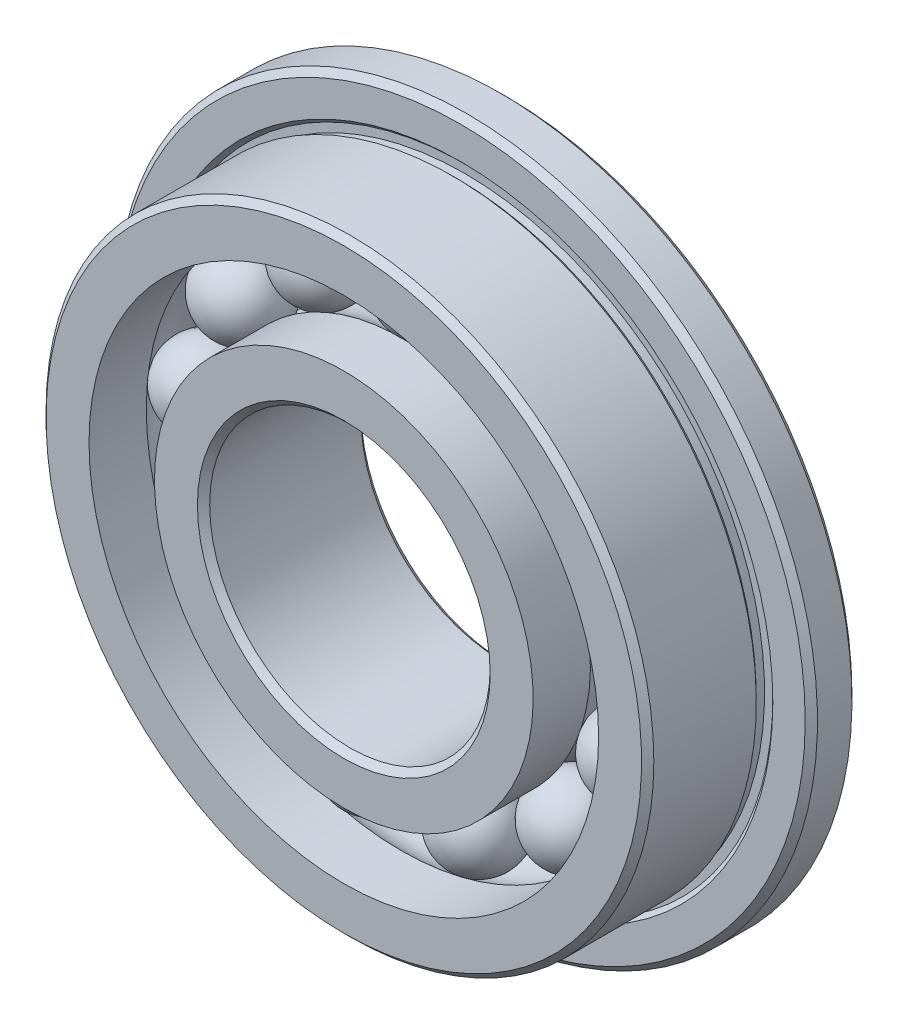
ISO-10303-21;
HEADER;
FILE_DESCRIPTION(('STEP AP214'),'2;1');
FILE_NAME('part.step','',(''),(''),'','','');
FILE_SCHEMA(('AUTOMOTIVE_DESIGN { 1 0 10303 214 1 1 1 1 }'));
ENDSEC;
DATA;
#1=APPLICATION_CONTEXT('core data for automotive mechanical design processes');
#2=APPLICATION_PROTOCOL_DEFINITION('international standard','automotive_design',2000,#1);
#3=PRODUCT_CONTEXT('',#1,'mechanical');
#4=PRODUCT('Part','Part','',(#3));
#5=PRODUCT_RELATED_PRODUCT_CATEGORY('part','',(#4));
#6=PRODUCT_DEFINITION_FORMATION('','',#4);
#7=PRODUCT_DEFINITION_CONTEXT('part definition',#1,'design');
#8=PRODUCT_DEFINITION('design','',#6,#7);
#9=PRODUCT_DEFINITION_SHAPE('','',#8);
#10=(LENGTH_UNIT() NAMED_UNIT(*) SI_UNIT(.MILLI.,.METRE.));
#11=(NAMED_UNIT(*) PLANE_ANGLE_UNIT() SI_UNIT($,.RADIAN.));
#12=(NAMED_UNIT(*) SI_UNIT($,.STERADIAN.) SOLID_ANGLE_UNIT());
#13=UNCERTAINTY_MEASURE_WITH_UNIT(LENGTH_MEASURE(1.E-05),#10,'distance_accuracy_value','');
#14=(GEOMETRIC_REPRESENTATION_CONTEXT(3) GLOBAL_UNCERTAINTY_ASSIGNED_CONTEXT((#13)) GLOBAL_UNIT_ASSIGNED_CONTEXT((#10,
#11,#12)) REPRESENTATION_CONTEXT('',''));
#15=CARTESIAN_POINT('',(0.,0.,0.));
#16=DIRECTION('',(0.,0.,1.));
#17=DIRECTION('',(1.,0.,0.));
#18=AXIS2_PLACEMENT_3D('',#15,#16,#17);
#19=CARTESIAN_POINT('',(-2.20743506720785,4.20591612185278,0.));
#20=DIRECTION('',(-0.464723172043758,0.885456025653216,0.));
#21=DIRECTION('',(0.885456025653216,0.464723172043758,0.));
#22=AXIS2_PLACEMENT_3D('',#19,#20,#21);
#23=SPHERICAL_SURFACE('',#22,0.875);
#24=CARTESIAN_POINT('',(-2.61406784274614,4.98069014429934,0.));
#25=VERTEX_POINT('',#24);
#26=VERTEX_LOOP('',#25);
#27=FACE_BOUND('',#26,.T.);
#28=ADVANCED_FACE('F41',(#27),#23,.T.);
#29=CLOSED_SHELL('',(#28));
#30=MANIFOLD_SOLID_BREP('B2',#29);
#31=CARTESIAN_POINT('',(-3.90917336299484,2.69830754697304,0.));
#32=DIRECTION('',(-0.82298386589365,0.568064746731166,0.));
#33=DIRECTION('',(0.568064746731166,0.82298386589365,0.));
#34=AXIS2_PLACEMENT_3D('',#31,#32,#33);
#35=SPHERICAL_SURFACE('',#34,0.875);
#36=CARTESIAN_POINT('',(-4.62928424565178,3.19536420036281,0.));
#37=VERTEX_POINT('',#36);
#38=VERTEX_LOOP('',#37);
#39=FACE_BOUND('',#38,.T.);
#40=ADVANCED_FACE('F61',(#39),#35,.T.);
#41=CLOSED_SHELL('',(#40));
#42=MANIFOLD_SOLID_BREP('B7',#41);
#43=CARTESIAN_POINT('',(-4.71536715196575,0.572549231212836,0.));
#44=DIRECTION('',(-0.992708874098053,0.120536680255334,0.));
#45=DIRECTION('',(0.120536680255334,0.992708874098053,0.));
#46=AXIS2_PLACEMENT_3D('',#43,#44,#45);
#47=SPHERICAL_SURFACE('',#46,0.875);
#48=CARTESIAN_POINT('',(-5.58398741680155,0.678018826436253,0.));
#49=VERTEX_POINT('',#48);
#50=VERTEX_LOOP('',#49);
#51=FACE_BOUND('',#50,.T.);
#52=ADVANCED_FACE('F81',(#51),#47,.T.);
#53=CLOSED_SHELL('',(#52));
#54=MANIFOLD_SOLID_BREP('B37',#53);
#55=CARTESIAN_POINT('',(-4.44132715275574,-1.684373213452,0.));
#56=DIRECTION('',(-0.935016242685418,-0.354604887042527,0.));
#57=DIRECTION('',(-0.354604887042527,0.935016242685418,0.));
#58=AXIS2_PLACEMENT_3D('',#55,#56,#57);
#59=SPHERICAL_SURFACE('',#58,0.875);
#60=CARTESIAN_POINT('',(-5.25946636510548,-1.99465248961421,0.));
#61=VERTEX_POINT('',#60);
#62=VERTEX_LOOP('',#61);
#63=FACE_BOUND('',#62,.T.);
#64=ADVANCED_FACE('F101',(#63),#59,.T.);
#65=CLOSED_SHELL('',(#64));
#66=MANIFOLD_SOLID_BREP('B57',#65);
#67=CARTESIAN_POINT('',(-3.14983262664381,-3.5554260538127,0.));
#68=DIRECTION('',(-0.663122658240802,-0.748510748171096,0.));
#69=DIRECTION('',(-0.748510748171096,0.663122658240802,0.));
#70=AXIS2_PLACEMENT_3D('',#67,#68,#69);
#71=SPHERICAL_SURFACE('',#70,0.875);
#72=CARTESIAN_POINT('',(-3.73006495260451,-4.21037295846241,0.));
#73=VERTEX_POINT('',#72);
#74=VERTEX_LOOP('',#73);
#75=FACE_BOUND('',#74,.T.);
#76=ADVANCED_FACE('F121',(#75),#71,.T.);
#77=CLOSED_SHELL('',(#76));
#78=MANIFOLD_SOLID_BREP('B77',#77);
#79=CARTESIAN_POINT('',(-1.13674940536593,-4.61197363277374,0.));
#80=DIRECTION('',(-0.239315664287565,-0.97094181742605,0.));
#81=DIRECTION('',(-0.97094181742605,0.239315664287565,0.));
#82=AXIS2_PLACEMENT_3D('',#79,#80,#81);
#83=SPHERICAL_SURFACE('',#82,0.875);
#84=CARTESIAN_POINT('',(-1.34615061161755,-5.46154772302153,0.));
#85=VERTEX_POINT('',#84);
#86=VERTEX_LOOP('',#85);
#87=FACE_BOUND('',#86,.T.);
#88=ADVANCED_FACE('F141',(#87),#83,.T.);
#89=CLOSED_SHELL('',(#88));
#90=MANIFOLD_SOLID_BREP('B97',#89);
#91=CARTESIAN_POINT('',(1.13674940536587,-4.61197363277375,0.));
#92=DIRECTION('',(0.239315664287552,-0.970941817426054,0.));
#93=DIRECTION('',(-0.970941817426054,-0.239315664287552,0.));
#94=AXIS2_PLACEMENT_3D('',#91,#92,#93);
#95=SPHERICAL_SURFACE('',#94,0.875);
#96=CARTESIAN_POINT('',(1.34615061161748,-5.46154772302155,0.));
#97=VERTEX_POINT('',#96);
#98=VERTEX_LOOP('',#97);
#99=FACE_BOUND('',#98,.T.);
#100=ADVANCED_FACE('F161',(#99),#95,.T.);
#101=CLOSED_SHELL('',(#100));
#102=MANIFOLD_SOLID_BREP('B117',#101);
#103=CARTESIAN_POINT('',(3.14983262664376,-3.55542605381275,0.));
#104=DIRECTION('',(0.663122658240791,-0.748510748171105,0.));
#105=DIRECTION('',(-0.748510748171105,-0.663122658240791,0.));
#106=AXIS2_PLACEMENT_3D('',#103,#104,#105);
#107=SPHERICAL_SURFACE('',#106,0.875);
#108=CARTESIAN_POINT('',(3.73006495260445,-4.21037295846246,0.));
#109=VERTEX_POINT('',#108);
#110=VERTEX_LOOP('',#109);
#111=FACE_BOUND('',#110,.T.);
#112=ADVANCED_FACE('F181',(#111),#107,.T.);
#113=CLOSED_SHELL('',(#112));
#114=MANIFOLD_SOLID_BREP('B137',#113);
#115=CARTESIAN_POINT('',(4.44132715275571,-1.68437321345206,0.));
#116=DIRECTION('',(0.935016242685413,-0.354604887042539,0.));
#117=DIRECTION('',(-0.354604887042539,-0.935016242685413,0.));
#118=AXIS2_PLACEMENT_3D('',#115,#116,#117);
#119=SPHERICAL_SURFACE('',#118,0.875);
#120=CARTESIAN_POINT('',(5.25946636510545,-1.99465248961429,0.));
#121=VERTEX_POINT('',#120);
#122=VERTEX_LOOP('',#121);
#123=FACE_BOUND('',#122,.T.);
#124=ADVANCED_FACE('F201',(#123),#119,.T.);
#125=CLOSED_SHELL('',(#124));
#126=MANIFOLD_SOLID_BREP('B157',#125);
#127=CARTESIAN_POINT('',(4.71536715196576,0.57254923121277,0.));
#128=DIRECTION('',(0.992708874098054,0.12053668025532,0.));
#129=DIRECTION('',(0.12053668025532,-0.992708874098054,0.));
#130=AXIS2_PLACEMENT_3D('',#127,#128,#129);
#131=SPHERICAL_SURFACE('',#130,0.875);
#132=CARTESIAN_POINT('',(5.58398741680156,0.678018826436175,0.));
#133=VERTEX_POINT('',#132);
#134=VERTEX_LOOP('',#133);
#135=FACE_BOUND('',#134,.T.);
#136=ADVANCED_FACE('F221',(#135),#131,.T.);
#137=CLOSED_SHELL('',(#136));
#138=MANIFOLD_SOLID_BREP('B177',#137);
#139=CARTESIAN_POINT('',(3.90917336299487,2.69830754697298,0.));
#140=DIRECTION('',(0.822983865893657,0.568064746731154,0.));
#141=DIRECTION('',(0.568064746731154,-0.822983865893657,0.));
#142=AXIS2_PLACEMENT_3D('',#139,#140,#141);
#143=SPHERICAL_SURFACE('',#142,0.875);
#144=CARTESIAN_POINT('',(4.62928424565182,3.19536420036274,0.));
#145=VERTEX_POINT('',#144);
#146=VERTEX_LOOP('',#145);
#147=FACE_BOUND('',#146,.T.);
#148=ADVANCED_FACE('F241',(#147),#143,.T.);
#149=CLOSED_SHELL('',(#148));
#150=MANIFOLD_SOLID_BREP('B197',#149);
#151=CARTESIAN_POINT('',(2.20743506720791,4.20591612185274,0.));
#152=DIRECTION('',(0.464723172043769,0.885456025653209,0.));
#153=DIRECTION('',(0.885456025653209,-0.464723172043769,0.));
#154=AXIS2_PLACEMENT_3D('',#151,#152,#153);
#155=SPHERICAL_SURFACE('',#154,0.875);
#156=CARTESIAN_POINT('',(2.6140678427462,4.9806901442993,0.));
#157=VERTEX_POINT('',#156);
#158=VERTEX_LOOP('',#157);
#159=FACE_BOUND('',#158,.T.);
#160=ADVANCED_FACE('F261',(#159),#155,.T.);
#161=CLOSED_SHELL('',(#160));
#162=MANIFOLD_SOLID_BREP('B217',#161);
#163=CARTESIAN_POINT('',(0.,4.75,0.));
#164=DIRECTION('',(0.,1.,0.));
#165=DIRECTION('',(1.,0.,0.));
#166=AXIS2_PLACEMENT_3D('',#163,#164,#165);
#167=SPHERICAL_SURFACE('',#166,0.875);
#168=CARTESIAN_POINT('',(0.,5.625,0.));
#169=VERTEX_POINT('',#168);
#170=VERTEX_LOOP('',#169);
#171=FACE_BOUND('',#170,.T.);
#172=ADVANCED_FACE('F284',(#171),#167,.T.);
#173=CLOSED_SHELL('',(#172));
#174=MANIFOLD_SOLID_BREP('B237',#173);
#175=CARTESIAN_POINT('',(0.,0.,0.));
#176=DIRECTION('',(0.,0.,1.));
#177=DIRECTION('',(0.,-1.,0.));
#178=AXIS2_PLACEMENT_3D('',#175,#176,#177);
#179=CYLINDRICAL_SURFACE('',#178,4.05);
#180=CARTESIAN_POINT('',(0.,0.,-0.525));
#181=DIRECTION('',(0.,0.,1.));
#182=DIRECTION('',(0.,-1.,0.));
#183=AXIS2_PLACEMENT_3D('',#180,#181,#182);
#184=CIRCLE('',#183,4.05);
#185=CARTESIAN_POINT('',(0.,-4.05,-0.525));
#186=VERTEX_POINT('',#185);
#187=EDGE_CURVE('E325',#186,#186,#184,.T.);
#188=ORIENTED_EDGE('',*,*,#187,.F.);
#189=EDGE_LOOP('',(#188));
#190=FACE_BOUND('',#189,.T.);
#191=CARTESIAN_POINT('',(0.,0.,-1.75));
#192=DIRECTION('',(0.,0.,1.));
#193=DIRECTION('',(0.,-1.,0.));
#194=AXIS2_PLACEMENT_3D('',#191,#192,#193);
#195=CIRCLE('',#194,4.05);
#196=CARTESIAN_POINT('',(0.,-4.05,-1.75));
#197=VERTEX_POINT('',#196);
#198=EDGE_CURVE('E334',#197,#197,#195,.T.);
#199=ORIENTED_EDGE('',*,*,#198,.T.);
#200=EDGE_LOOP('',(#199));
#201=FACE_BOUND('',#200,.T.);
#202=ADVANCED_FACE('F305',(#190,#201),#179,.T.);
#203=CARTESIAN_POINT('',(0.,0.,0.));
#204=DIRECTION('',(0.,0.,1.));
#205=DIRECTION('',(0.,-1.,0.));
#206=AXIS2_PLACEMENT_3D('',#203,#204,#205);
#207=TOROIDAL_SURFACE('',#206,4.75,0.875);
#208=CARTESIAN_POINT('',(0.,0.,0.525));
#209=DIRECTION('',(0.,0.,1.));
#210=DIRECTION('',(0.,-1.,0.));
#211=AXIS2_PLACEMENT_3D('',#208,#209,#210);
#212=CIRCLE('',#211,4.05);
#213=CARTESIAN_POINT('',(0.,-4.05,0.525));
#214=VERTEX_POINT('',#213);
#215=EDGE_CURVE('E328',#214,#214,#212,.T.);
#216=ORIENTED_EDGE('',*,*,#215,.F.);
#217=EDGE_LOOP('',(#216));
#218=FACE_BOUND('',#217,.T.);
#219=ORIENTED_EDGE('',*,*,#187,.T.);
#220=EDGE_LOOP('',(#219));
#221=FACE_BOUND('',#220,.T.);
#222=ADVANCED_FACE('F353',(#218,#221),#207,.F.);
#223=CARTESIAN_POINT('',(0.,0.,0.));
#224=DIRECTION('',(0.,0.,1.));
#225=DIRECTION('',(0.,-1.,0.));
#226=AXIS2_PLACEMENT_3D('',#223,#224,#225);
#227=CYLINDRICAL_SURFACE('',#226,4.05);
#228=CARTESIAN_POINT('',(0.,0.,1.75));
#229=DIRECTION('',(0.,0.,1.));
#230=DIRECTION('',(0.,-1.,0.));
#231=AXIS2_PLACEMENT_3D('',#228,#229,#230);
#232=CIRCLE('',#231,4.05);
#233=CARTESIAN_POINT('',(0.,-4.05,1.75));
#234=VERTEX_POINT('',#233);
#235=EDGE_CURVE('E331',#234,#234,#232,.T.);
#236=ORIENTED_EDGE('',*,*,#235,.F.);
#237=EDGE_LOOP('',(#236));
#238=FACE_BOUND('',#237,.T.);
#239=ORIENTED_EDGE('',*,*,#215,.T.);
#240=EDGE_LOOP('',(#239));
#241=FACE_BOUND('',#240,.T.);
#242=ADVANCED_FACE('F359',(#238,#241),#227,.T.);
#243=CARTESIAN_POINT('',(0.,3.,1.75));
#244=DIRECTION('',(0.,0.,-1.));
#245=DIRECTION('',(0.,1.,0.));
#246=AXIS2_PLACEMENT_3D('',#243,#244,#245);
#247=PLANE('',#246);
#248=CARTESIAN_POINT('',(0.,0.,1.75));
#249=DIRECTION('',(0.,0.,-1.));
#250=DIRECTION('',(0.,1.,0.));
#251=AXIS2_PLACEMENT_3D('',#248,#249,#250);
#252=CIRCLE('',#251,3.13125);
#253=CARTESIAN_POINT('',(0.,3.13125,1.75));
#254=VERTEX_POINT('',#253);
#255=EDGE_CURVE('E283',#254,#254,#252,.T.);
#256=ORIENTED_EDGE('',*,*,#255,.T.);
#257=EDGE_LOOP('',(#256));
#258=FACE_BOUND('',#257,.T.);
#259=ORIENTED_EDGE('',*,*,#235,.T.);
#260=EDGE_LOOP('',(#259));
#261=FACE_BOUND('',#260,.T.);
#262=ADVANCED_FACE('F350',(#258,#261),#247,.F.);
#263=CARTESIAN_POINT('',(0.,0.,0.));
#264=DIRECTION('',(0.,0.,1.));
#265=DIRECTION('',(0.,-1.,0.));
#266=AXIS2_PLACEMENT_3D('',#263,#264,#265);
#267=CYLINDRICAL_SURFACE('',#266,3.);
#268=CARTESIAN_POINT('',(0.,0.,-1.61875));
#269=DIRECTION('',(0.,0.,1.));
#270=DIRECTION('',(0.,-1.,0.));
#271=AXIS2_PLACEMENT_3D('',#268,#269,#270);
#272=CIRCLE('',#271,3.);
#273=CARTESIAN_POINT('',(0.,-3.,-1.61875));
#274=VERTEX_POINT('',#273);
#275=EDGE_CURVE('E312',#274,#274,#272,.F.);
#276=ORIENTED_EDGE('',*,*,#275,.T.);
#277=EDGE_LOOP('',(#276));
#278=FACE_BOUND('',#277,.T.);
#279=CARTESIAN_POINT('',(0.,0.,1.61875));
#280=DIRECTION('',(0.,0.,-1.));
#281=DIRECTION('',(0.,1.,0.));
#282=AXIS2_PLACEMENT_3D('',#279,#280,#281);
#283=CIRCLE('',#282,3.);
#284=CARTESIAN_POINT('',(0.,3.,1.61875));
#285=VERTEX_POINT('',#284);
#286=EDGE_CURVE('E316',#285,#285,#283,.F.);
#287=ORIENTED_EDGE('',*,*,#286,.T.);
#288=EDGE_LOOP('',(#287));
#289=FACE_BOUND('',#288,.T.);
#290=ADVANCED_FACE('F342',(#278,#289),#267,.F.);
#291=CARTESIAN_POINT('',(0.,4.05,-1.75));
#292=DIRECTION('',(0.,0.,1.));
#293=DIRECTION('',(0.,-1.,0.));
#294=AXIS2_PLACEMENT_3D('',#291,#292,#293);
#295=PLANE('',#294);
#296=CARTESIAN_POINT('',(0.,0.,-1.75));
#297=DIRECTION('',(0.,0.,1.));
#298=DIRECTION('',(0.,-1.,0.));
#299=AXIS2_PLACEMENT_3D('',#296,#297,#298);
#300=CIRCLE('',#299,3.13125);
#301=CARTESIAN_POINT('',(0.,-3.13125,-1.75));
#302=VERTEX_POINT('',#301);
#303=EDGE_CURVE('E320',#302,#302,#300,.T.);
#304=ORIENTED_EDGE('',*,*,#303,.T.);
#305=EDGE_LOOP('',(#304));
#306=FACE_BOUND('',#305,.T.);
#307=ORIENTED_EDGE('',*,*,#198,.F.);
#308=EDGE_LOOP('',(#307));
#309=FACE_BOUND('',#308,.T.);
#310=ADVANCED_FACE('F339',(#306,#309),#295,.F.);
#311=CARTESIAN_POINT('',(0.,0.,-1.75));
#312=DIRECTION('',(0.,0.,-1.));
#313=DIRECTION('',(0.,1.,0.));
#314=AXIS2_PLACEMENT_3D('',#311,#312,#313);
#315=CONICAL_SURFACE('',#314,3.13125,0.785398163397447);
#316=ORIENTED_EDGE('',*,*,#275,.F.);
#317=EDGE_LOOP('',(#316));
#318=FACE_BOUND('',#317,.T.);
#319=ORIENTED_EDGE('',*,*,#303,.F.);
#320=EDGE_LOOP('',(#319));
#321=FACE_BOUND('',#320,.T.);
#322=ADVANCED_FACE('F341',(#318,#321),#315,.F.);
#323=CARTESIAN_POINT('',(0.,0.,1.61875));
#324=DIRECTION('',(0.,0.,1.));
#325=DIRECTION('',(0.,-1.,0.));
#326=AXIS2_PLACEMENT_3D('',#323,#324,#325);
#327=CONICAL_SURFACE('',#326,3.,0.785398163397447);
#328=ORIENTED_EDGE('',*,*,#255,.F.);
#329=EDGE_LOOP('',(#328));
#330=FACE_BOUND('',#329,.T.);
#331=ORIENTED_EDGE('',*,*,#286,.F.);
#332=EDGE_LOOP('',(#331));
#333=FACE_BOUND('',#332,.T.);
#334=ADVANCED_FACE('F307',(#330,#333),#327,.F.);
#335=CLOSED_SHELL('',(#202,#222,#242,#262,#290,#310,#322,#334));
#336=MANIFOLD_SOLID_BREP('B257',#335);
#337=CARTESIAN_POINT('',(0.,5.45,-1.75));
#338=DIRECTION('',(0.,0.,1.));
#339=DIRECTION('',(0.,-1.,0.));
#340=AXIS2_PLACEMENT_3D('',#337,#338,#339);
#341=PLANE('',#340);
#342=CARTESIAN_POINT('',(0.,0.,-1.75));
#343=DIRECTION('',(0.,0.,1.));
#344=DIRECTION('',(0.,-1.,0.));
#345=AXIS2_PLACEMENT_3D('',#342,#343,#344);
#346=CIRCLE('',#345,7.36875);
#347=CARTESIAN_POINT('',(0.,-7.36875,-1.75));
#348=VERTEX_POINT('',#347);
#349=EDGE_CURVE('E442',#348,#348,#346,.F.);
#350=ORIENTED_EDGE('',*,*,#349,.T.);
#351=EDGE_LOOP('',(#350));
#352=FACE_BOUND('',#351,.T.);
#353=CARTESIAN_POINT('',(0.,0.,-1.75));
#354=DIRECTION('',(0.,0.,1.));
#355=DIRECTION('',(0.,-1.,0.));
#356=AXIS2_PLACEMENT_3D('',#353,#354,#355);
#357=CIRCLE('',#356,5.45);
#358=CARTESIAN_POINT('',(0.,-5.45,-1.75));
#359=VERTEX_POINT('',#358);
#360=EDGE_CURVE('E453',#359,#359,#357,.T.);
#361=ORIENTED_EDGE('',*,*,#360,.T.);
#362=EDGE_LOOP('',(#361));
#363=FACE_BOUND('',#362,.T.);
#364=ADVANCED_FACE('F427',(#352,#363),#341,.F.);
#365=CARTESIAN_POINT('',(0.,0.,0.));
#366=DIRECTION('',(0.,0.,1.));
#367=DIRECTION('',(0.,-1.,0.));
#368=AXIS2_PLACEMENT_3D('',#365,#366,#367);
#369=CYLINDRICAL_SURFACE('',#368,5.45);
#370=ORIENTED_EDGE('',*,*,#360,.F.);
#371=EDGE_LOOP('',(#370));
#372=FACE_BOUND('',#371,.T.);
#373=CARTESIAN_POINT('',(0.,0.,-0.525));
#374=DIRECTION('',(0.,0.,1.));
#375=DIRECTION('',(0.,-1.,0.));
#376=AXIS2_PLACEMENT_3D('',#373,#374,#375);
#377=CIRCLE('',#376,5.45);
#378=CARTESIAN_POINT('',(0.,-5.45,-0.525));
#379=VERTEX_POINT('',#378);
#380=EDGE_CURVE('E456',#379,#379,#377,.T.);
#381=ORIENTED_EDGE('',*,*,#380,.T.);
#382=EDGE_LOOP('',(#381));
#383=FACE_BOUND('',#382,.T.);
#384=ADVANCED_FACE('F499',(#372,#383),#369,.F.);
#385=CARTESIAN_POINT('',(0.,0.,0.));
#386=DIRECTION('',(0.,0.,1.));
#387=DIRECTION('',(0.,-1.,0.));
#388=AXIS2_PLACEMENT_3D('',#385,#386,#387);
#389=TOROIDAL_SURFACE('',#388,4.75,0.875);
#390=ORIENTED_EDGE('',*,*,#380,.F.);
#391=EDGE_LOOP('',(#390));
#392=FACE_BOUND('',#391,.T.);
#393=CARTESIAN_POINT('',(0.,0.,0.525));
#394=DIRECTION('',(0.,0.,1.));
#395=DIRECTION('',(0.,-1.,0.));
#396=AXIS2_PLACEMENT_3D('',#393,#394,#395);
#397=CIRCLE('',#396,5.45);
#398=CARTESIAN_POINT('',(0.,-5.45,0.525));
#399=VERTEX_POINT('',#398);
#400=EDGE_CURVE('E459',#399,#399,#397,.T.);
#401=ORIENTED_EDGE('',*,*,#400,.T.);
#402=EDGE_LOOP('',(#401));
#403=FACE_BOUND('',#402,.T.);
#404=ADVANCED_FACE('F505',(#392,#403),#389,.F.);
#405=CARTESIAN_POINT('',(0.,0.,0.));
#406=DIRECTION('',(0.,0.,1.));
#407=DIRECTION('',(0.,-1.,0.));
#408=AXIS2_PLACEMENT_3D('',#405,#406,#407);
#409=CYLINDRICAL_SURFACE('',#408,5.45);
#410=ORIENTED_EDGE('',*,*,#400,.F.);
#411=EDGE_LOOP('',(#410));
#412=FACE_BOUND('',#411,.T.);
#413=CARTESIAN_POINT('',(0.,0.,1.75));
#414=DIRECTION('',(0.,0.,1.));
#415=DIRECTION('',(0.,-1.,0.));
#416=AXIS2_PLACEMENT_3D('',#413,#414,#415);
#417=CIRCLE('',#416,5.45);
#418=CARTESIAN_POINT('',(0.,-5.45,1.75));
#419=VERTEX_POINT('',#418);
#420=EDGE_CURVE('E462',#419,#419,#417,.T.);
#421=ORIENTED_EDGE('',*,*,#420,.T.);
#422=EDGE_LOOP('',(#421));
#423=FACE_BOUND('',#422,.T.);
#424=ADVANCED_FACE('F569',(#412,#423),#409,.F.);
#425=CARTESIAN_POINT('',(0.,6.5,1.75));
#426=DIRECTION('',(0.,0.,-1.));
#427=DIRECTION('',(0.,1.,0.));
#428=AXIS2_PLACEMENT_3D('',#425,#426,#427);
#429=PLANE('',#428);
#430=CARTESIAN_POINT('',(0.,0.,1.75));
#431=DIRECTION('',(0.,0.,-1.));
#432=DIRECTION('',(0.,1.,0.));
#433=AXIS2_PLACEMENT_3D('',#430,#431,#432);
#434=CIRCLE('',#433,6.36875);
#435=CARTESIAN_POINT('',(0.,6.36875,1.75));
#436=VERTEX_POINT('',#435);
#437=EDGE_CURVE('E434',#436,#436,#434,.F.);
#438=ORIENTED_EDGE('',*,*,#437,.T.);
#439=EDGE_LOOP('',(#438));
#440=FACE_BOUND('',#439,.T.);
#441=ORIENTED_EDGE('',*,*,#420,.F.);
#442=EDGE_LOOP('',(#441));
#443=FACE_BOUND('',#442,.T.);
#444=ADVANCED_FACE('F559',(#440,#443),#429,.F.);
#445=CARTESIAN_POINT('',(0.,0.,0.));
#446=DIRECTION('',(0.,0.,1.));
#447=DIRECTION('',(0.,-1.,0.));
#448=AXIS2_PLACEMENT_3D('',#445,#446,#447);
#449=CYLINDRICAL_SURFACE('',#448,6.5);
#450=CARTESIAN_POINT('',(0.,0.,1.61875));
#451=DIRECTION('',(0.,0.,-1.));
#452=DIRECTION('',(0.,1.,0.));
#453=AXIS2_PLACEMENT_3D('',#450,#451,#452);
#454=CIRCLE('',#453,6.5);
#455=CARTESIAN_POINT('',(0.,6.5,1.61875));
#456=VERTEX_POINT('',#455);
#457=EDGE_CURVE('E304',#456,#456,#454,.T.);
#458=ORIENTED_EDGE('',*,*,#457,.T.);
#459=EDGE_LOOP('',(#458));
#460=FACE_BOUND('',#459,.T.);
#461=CARTESIAN_POINT('',(0.,0.,-0.573223304703362));
#462=DIRECTION('',(0.,0.,1.));
#463=DIRECTION('',(0.,-1.,0.));
#464=AXIS2_PLACEMENT_3D('',#461,#462,#463);
#465=CIRCLE('',#464,6.5);
#466=CARTESIAN_POINT('',(0.,-6.5,-0.573223304703363));
#467=VERTEX_POINT('',#466);
#468=EDGE_CURVE('E465',#467,#467,#465,.T.);
#469=ORIENTED_EDGE('',*,*,#468,.T.);
#470=EDGE_LOOP('',(#469));
#471=FACE_BOUND('',#470,.T.);
#472=ADVANCED_FACE('F553',(#460,#471),#449,.T.);
#473=CARTESIAN_POINT('',(0.,0.,-0.661611652351683));
#474=DIRECTION('',(0.,0.,1.));
#475=DIRECTION('',(0.,-1.,0.));
#476=AXIS2_PLACEMENT_3D('',#473,#474,#475);
#477=CONICAL_SURFACE('',#476,6.41161165235168,0.785398163397447);
#478=ORIENTED_EDGE('',*,*,#468,.F.);
#479=EDGE_LOOP('',(#478));
#480=FACE_BOUND('',#479,.T.);
#481=CARTESIAN_POINT('',(0.,0.,-0.661611652351683));
#482=DIRECTION('',(0.,0.,1.));
#483=DIRECTION('',(0.,-1.,0.));
#484=AXIS2_PLACEMENT_3D('',#481,#482,#483);
#485=CIRCLE('',#484,6.41161165235168);
#486=CARTESIAN_POINT('',(0.,-6.41161165235168,-0.661611652351683));
#487=VERTEX_POINT('',#486);
#488=EDGE_CURVE('E468',#487,#487,#485,.T.);
#489=ORIENTED_EDGE('',*,*,#488,.T.);
#490=EDGE_LOOP('',(#489));
#491=FACE_BOUND('',#490,.T.);
#492=ADVANCED_FACE('F558',(#480,#491),#477,.T.);
#493=CARTESIAN_POINT('',(0.,0.,0.));
#494=DIRECTION('',(0.,0.,1.));
#495=DIRECTION('',(0.,-1.,0.));
#496=AXIS2_PLACEMENT_3D('',#493,#494,#495);
#497=CYLINDRICAL_SURFACE('',#496,6.41161165235168);
#498=ORIENTED_EDGE('',*,*,#488,.F.);
#499=EDGE_LOOP('',(#498));
#500=FACE_BOUND('',#499,.T.);
#501=CARTESIAN_POINT('',(0.,0.,-0.83838834764832));
#502=DIRECTION('',(0.,0.,1.));
#503=DIRECTION('',(0.,-1.,0.));
#504=AXIS2_PLACEMENT_3D('',#501,#502,#503);
#505=CIRCLE('',#504,6.41161165235168);
#506=CARTESIAN_POINT('',(0.,-6.41161165235168,-0.83838834764832));
#507=VERTEX_POINT('',#506);
#508=EDGE_CURVE('E471',#507,#507,#505,.T.);
#509=ORIENTED_EDGE('',*,*,#508,.T.);
#510=EDGE_LOOP('',(#509));
#511=FACE_BOUND('',#510,.T.);
#512=ADVANCED_FACE('F591',(#500,#511),#497,.T.);
#513=CARTESIAN_POINT('',(0.,6.58838834764832,-0.83838834764832));
#514=DIRECTION('',(0.,0.,-1.));
#515=DIRECTION('',(0.,1.,0.));
#516=AXIS2_PLACEMENT_3D('',#513,#514,#515);
#517=PLANE('',#516);
#518=ORIENTED_EDGE('',*,*,#508,.F.);
#519=EDGE_LOOP('',(#518));
#520=FACE_BOUND('',#519,.T.);
#521=CARTESIAN_POINT('',(0.,0.,-0.83838834764832));
#522=DIRECTION('',(0.,0.,1.));
#523=DIRECTION('',(0.,-1.,0.));
#524=AXIS2_PLACEMENT_3D('',#521,#522,#523);
#525=CIRCLE('',#524,6.58838834764832);
#526=CARTESIAN_POINT('',(0.,-6.58838834764832,-0.83838834764832));
#527=VERTEX_POINT('',#526);
#528=EDGE_CURVE('E474',#527,#527,#525,.T.);
#529=ORIENTED_EDGE('',*,*,#528,.T.);
#530=EDGE_LOOP('',(#529));
#531=FACE_BOUND('',#530,.T.);
#532=ADVANCED_FACE('F495',(#520,#531),#517,.F.);
#533=CARTESIAN_POINT('',(0.,0.,-0.750000000000001));
#534=DIRECTION('',(0.,0.,1.));
#535=DIRECTION('',(0.,-1.,0.));
#536=AXIS2_PLACEMENT_3D('',#533,#534,#535);
#537=CONICAL_SURFACE('',#536,6.67677669529663,0.785398163397447);
#538=ORIENTED_EDGE('',*,*,#528,.F.);
#539=EDGE_LOOP('',(#538));
#540=FACE_BOUND('',#539,.T.);
#541=CARTESIAN_POINT('',(0.,0.,-0.750000000000001));
#542=DIRECTION('',(0.,0.,1.));
#543=DIRECTION('',(0.,-1.,0.));
#544=AXIS2_PLACEMENT_3D('',#541,#542,#543);
#545=CIRCLE('',#544,6.67677669529663);
#546=CARTESIAN_POINT('',(0.,-6.67677669529663,-0.750000000000001));
#547=VERTEX_POINT('',#546);
#548=EDGE_CURVE('E477',#547,#547,#545,.T.);
#549=ORIENTED_EDGE('',*,*,#548,.T.);
#550=EDGE_LOOP('',(#549));
#551=FACE_BOUND('',#550,.T.);
#552=ADVANCED_FACE('F481',(#540,#551),#537,.F.);
#553=CARTESIAN_POINT('',(0.,7.5,-0.75));
#554=DIRECTION('',(0.,0.,-1.));
#555=DIRECTION('',(0.,1.,0.));
#556=AXIS2_PLACEMENT_3D('',#553,#554,#555);
#557=PLANE('',#556);
#558=CARTESIAN_POINT('',(0.,0.,-0.750000000000001));
#559=DIRECTION('',(0.,0.,-1.));
#560=DIRECTION('',(0.,1.,0.));
#561=AXIS2_PLACEMENT_3D('',#558,#559,#560);
#562=CIRCLE('',#561,7.36875);
#563=CARTESIAN_POINT('',(0.,7.36875,-0.75));
#564=VERTEX_POINT('',#563);
#565=EDGE_CURVE('E438',#564,#564,#562,.F.);
#566=ORIENTED_EDGE('',*,*,#565,.T.);
#567=EDGE_LOOP('',(#566));
#568=FACE_BOUND('',#567,.T.);
#569=ORIENTED_EDGE('',*,*,#548,.F.);
#570=EDGE_LOOP('',(#569));
#571=FACE_BOUND('',#570,.T.);
#572=ADVANCED_FACE('F483',(#568,#571),#557,.F.);
#573=CARTESIAN_POINT('',(0.,0.,0.));
#574=DIRECTION('',(0.,0.,1.));
#575=DIRECTION('',(0.,-1.,0.));
#576=AXIS2_PLACEMENT_3D('',#573,#574,#575);
#577=CYLINDRICAL_SURFACE('',#576,7.5);
#578=CARTESIAN_POINT('',(0.,0.,-1.61875));
#579=DIRECTION('',(0.,0.,1.));
#580=DIRECTION('',(0.,-1.,0.));
#581=AXIS2_PLACEMENT_3D('',#578,#579,#580);
#582=CIRCLE('',#581,7.5);
#583=CARTESIAN_POINT('',(0.,-7.5,-1.61875));
#584=VERTEX_POINT('',#583);
#585=EDGE_CURVE('E447',#584,#584,#582,.T.);
#586=ORIENTED_EDGE('',*,*,#585,.T.);
#587=EDGE_LOOP('',(#586));
#588=FACE_BOUND('',#587,.T.);
#589=CARTESIAN_POINT('',(0.,0.,-0.881250000000001));
#590=DIRECTION('',(0.,0.,-1.));
#591=DIRECTION('',(0.,1.,0.));
#592=AXIS2_PLACEMENT_3D('',#589,#590,#591);
#593=CIRCLE('',#592,7.5);
#594=CARTESIAN_POINT('',(0.,7.5,-0.881250000000001));
#595=VERTEX_POINT('',#594);
#596=EDGE_CURVE('E450',#595,#595,#593,.T.);
#597=ORIENTED_EDGE('',*,*,#596,.T.);
#598=EDGE_LOOP('',(#597));
#599=FACE_BOUND('',#598,.T.);
#600=ADVANCED_FACE('F485',(#588,#599),#577,.T.);
#601=CARTESIAN_POINT('',(0.,0.,-1.61875));
#602=DIRECTION('',(0.,0.,1.));
#603=DIRECTION('',(0.,-1.,0.));
#604=AXIS2_PLACEMENT_3D('',#601,#602,#603);
#605=CONICAL_SURFACE('',#604,7.5,0.785398163397449);
#606=ORIENTED_EDGE('',*,*,#349,.F.);
#607=EDGE_LOOP('',(#606));
#608=FACE_BOUND('',#607,.T.);
#609=ORIENTED_EDGE('',*,*,#585,.F.);
#610=EDGE_LOOP('',(#609));
#611=FACE_BOUND('',#610,.T.);
#612=ADVANCED_FACE('F492',(#608,#611),#605,.T.);
#613=CARTESIAN_POINT('',(0.,0.,-0.750000000000001));
#614=DIRECTION('',(0.,0.,-1.));
#615=DIRECTION('',(0.,1.,0.));
#616=AXIS2_PLACEMENT_3D('',#613,#614,#615);
#617=CONICAL_SURFACE('',#616,7.36875,0.785398163397449);
#618=ORIENTED_EDGE('',*,*,#596,.F.);
#619=EDGE_LOOP('',(#618));
#620=FACE_BOUND('',#619,.T.);
#621=ORIENTED_EDGE('',*,*,#565,.F.);
#622=EDGE_LOOP('',(#621));
#623=FACE_BOUND('',#622,.T.);
#624=ADVANCED_FACE('F512',(#620,#623),#617,.T.);
#625=CARTESIAN_POINT('',(0.,0.,1.75));
#626=DIRECTION('',(0.,0.,-1.));
#627=DIRECTION('',(0.,1.,0.));
#628=AXIS2_PLACEMENT_3D('',#625,#626,#627);
#629=CONICAL_SURFACE('',#628,6.36875,0.785398163397449);
#630=ORIENTED_EDGE('',*,*,#457,.F.);
#631=EDGE_LOOP('',(#630));
#632=FACE_BOUND('',#631,.T.);
#633=ORIENTED_EDGE('',*,*,#437,.F.);
#634=EDGE_LOOP('',(#633));
#635=FACE_BOUND('',#634,.T.);
#636=ADVANCED_FACE('F429',(#632,#635),#629,.T.);
#637=CLOSED_SHELL('',(#364,#384,#404,#424,#444,#472,#492,#512,#532,#552,#572,#600,#612,#624,#636));
#638=MANIFOLD_SOLID_BREP('B278',#637);
#639=ADVANCED_BREP_SHAPE_REPRESENTATION('',(#18,#30,#42,#54,#66,#78,#90,#102,#114,#126,#138,
#150,#162,#174,#336,#638),#14);
#640=SHAPE_DEFINITION_REPRESENTATION(#9,#639);
ENDSEC;
END-ISO-10303-21;
